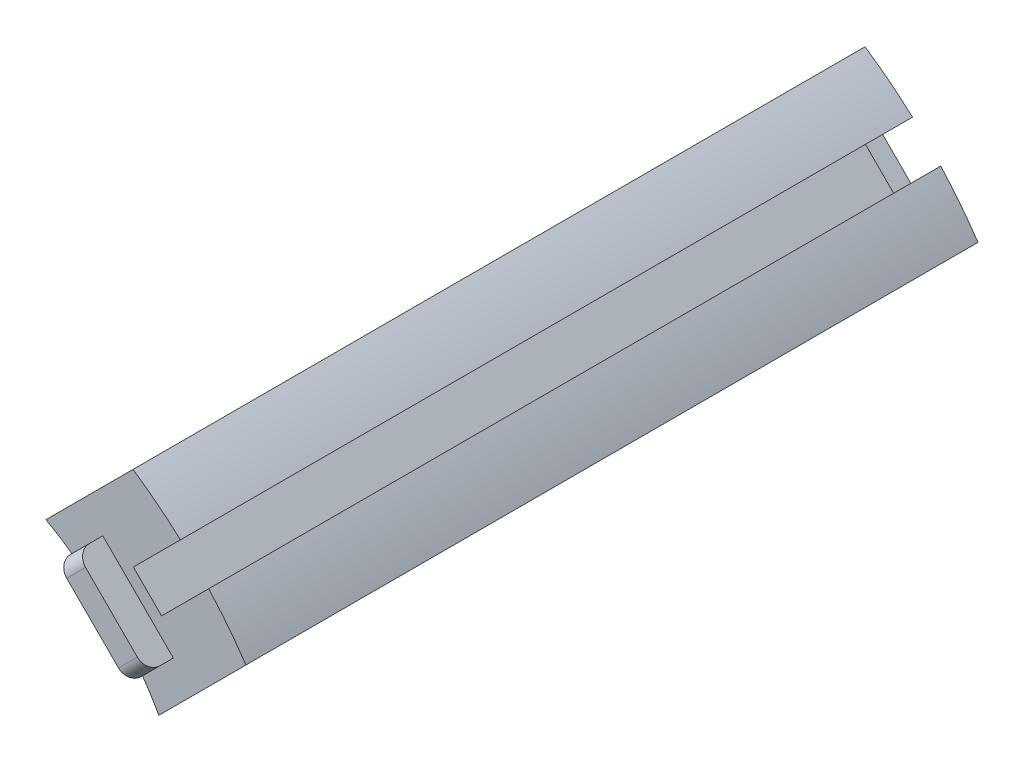
ISO-10303-21;
HEADER;
FILE_DESCRIPTION(('STEP AP214'),'2;1');
FILE_NAME('part.step','',(''),(''),'','','');
FILE_SCHEMA(('AUTOMOTIVE_DESIGN { 1 0 10303 214 1 1 1 1 }'));
ENDSEC;
DATA;
#1=APPLICATION_CONTEXT('core data for automotive mechanical design processes');
#2=APPLICATION_PROTOCOL_DEFINITION('international standard','automotive_design',2000,#1);
#3=PRODUCT_CONTEXT('',#1,'mechanical');
#4=PRODUCT('Part','Part','',(#3));
#5=PRODUCT_RELATED_PRODUCT_CATEGORY('part','',(#4));
#6=PRODUCT_DEFINITION_FORMATION('','',#4);
#7=PRODUCT_DEFINITION_CONTEXT('part definition',#1,'design');
#8=PRODUCT_DEFINITION('design','',#6,#7);
#9=PRODUCT_DEFINITION_SHAPE('','',#8);
#10=(LENGTH_UNIT() NAMED_UNIT(*) SI_UNIT(.MILLI.,.METRE.));
#11=(NAMED_UNIT(*) PLANE_ANGLE_UNIT() SI_UNIT($,.RADIAN.));
#12=(NAMED_UNIT(*) SI_UNIT($,.STERADIAN.) SOLID_ANGLE_UNIT());
#13=UNCERTAINTY_MEASURE_WITH_UNIT(LENGTH_MEASURE(1.E-05),#10,'distance_accuracy_value','');
#14=(GEOMETRIC_REPRESENTATION_CONTEXT(3) GLOBAL_UNCERTAINTY_ASSIGNED_CONTEXT((#13)) GLOBAL_UNIT_ASSIGNED_CONTEXT((#10,
#11,#12)) REPRESENTATION_CONTEXT('',''));
#15=CARTESIAN_POINT('',(0.,0.,0.));
#16=DIRECTION('',(0.,0.,1.));
#17=DIRECTION('',(1.,0.,0.));
#18=AXIS2_PLACEMENT_3D('',#15,#16,#17);
#19=CARTESIAN_POINT('',(-0.0846540823924782,-0.00642855221168886,110.));
#20=DIRECTION('',(0.,0.,-1.));
#21=DIRECTION('',(-1.,0.,0.));
#22=AXIS2_PLACEMENT_3D('',#19,#20,#21);
#23=CYLINDRICAL_SURFACE('',#22,44.5);
#24=CARTESIAN_POINT('',(-0.0846540823924782,-0.00642855221168886,0.));
#25=DIRECTION('',(0.,0.,1.));
#26=DIRECTION('',(1.,0.,0.));
#27=AXIS2_PLACEMENT_3D('',#24,#25,#26);
#28=CIRCLE('',#27,44.5);
#29=CARTESIAN_POINT('',(38.7012048440975,21.808867625801,0.));
#30=VERTEX_POINT('',#29);
#31=CARTESIAN_POINT('',(21.7306420956204,38.7794303742782,0.));
#32=VERTEX_POINT('',#31);
#33=EDGE_CURVE('E232',#30,#32,#28,.T.);
#34=ORIENTED_EDGE('',*,*,#33,.F.);
#35=DIRECTION('',(0.,0.,-1.));
#36=VECTOR('',#35,1.);
#37=CARTESIAN_POINT('',(38.7012048440975,21.808867625801,110.));
#38=LINE('',#37,#36);
#39=CARTESIAN_POINT('',(38.7012048440975,21.808867625801,110.));
#40=VERTEX_POINT('',#39);
#41=EDGE_CURVE('E289',#40,#30,#38,.T.);
#42=ORIENTED_EDGE('',*,*,#41,.F.);
#43=CARTESIAN_POINT('',(-0.0846540823924782,-0.00642855221168886,110.));
#44=DIRECTION('',(0.,0.,1.));
#45=DIRECTION('',(1.,0.,0.));
#46=AXIS2_PLACEMENT_3D('',#43,#44,#45);
#47=CIRCLE('',#46,44.5);
#48=CARTESIAN_POINT('',(21.7306420956204,38.7794303742782,110.));
#49=VERTEX_POINT('',#48);
#50=EDGE_CURVE('E233',#40,#49,#47,.T.);
#51=ORIENTED_EDGE('',*,*,#50,.T.);
#52=DIRECTION('',(0.,0.,-1.));
#53=VECTOR('',#52,1.);
#54=CARTESIAN_POINT('',(21.7306420956204,38.7794303742782,110.));
#55=LINE('',#54,#53);
#56=EDGE_CURVE('E254',#49,#32,#55,.T.);
#57=ORIENTED_EDGE('',*,*,#56,.T.);
#58=EDGE_LOOP('',(#34,#42,#51,#57));
#59=FACE_BOUND('',#58,.T.);
#60=ADVANCED_FACE('F35',(#59),#23,.F.);
#61=CARTESIAN_POINT('',(8.44616860914818,-8.4461686091482,110.));
#62=DIRECTION('',(0.707106781186547,-0.707106781186548,0.));
#63=DIRECTION('',(0.707106781186548,0.707106781186547,0.));
#64=AXIS2_PLACEMENT_3D('',#61,#62,#63);
#65=PLANE('',#64);
#66=CARTESIAN_POINT('',(49.0034673312299,32.1111301129334,85.));
#67=DIRECTION('',(0.707106781186547,-0.707106781186548,0.));
#68=DIRECTION('',(0.707106781186548,0.707106781186547,0.));
#69=AXIS2_PLACEMENT_3D('',#66,#67,#68);
#70=CIRCLE('',#69,3.00000000000001);
#71=CARTESIAN_POINT('',(51.1247876747896,34.2324504564931,85.));
#72=VERTEX_POINT('',#71);
#73=EDGE_CURVE('E229',#72,#72,#70,.T.);
#74=ORIENTED_EDGE('',*,*,#73,.F.);
#75=EDGE_LOOP('',(#74));
#76=FACE_BOUND('',#75,.T.);
#77=CARTESIAN_POINT('',(49.0034673312299,32.1111301129334,55.));
#78=DIRECTION('',(0.707106781186547,-0.707106781186548,0.));
#79=DIRECTION('',(0.707106781186548,0.707106781186547,0.));
#80=AXIS2_PLACEMENT_3D('',#77,#78,#79);
#81=CIRCLE('',#80,2.99999999999999);
#82=CARTESIAN_POINT('',(51.1247876747895,34.232450456493,55.));
#83=VERTEX_POINT('',#82);
#84=EDGE_CURVE('E219',#83,#83,#81,.T.);
#85=ORIENTED_EDGE('',*,*,#84,.F.);
#86=EDGE_LOOP('',(#85));
#87=FACE_BOUND('',#86,.T.);
#88=CARTESIAN_POINT('',(49.0034673312299,32.1111301129334,25.));
#89=DIRECTION('',(0.707106781186547,-0.707106781186548,0.));
#90=DIRECTION('',(0.707106781186548,0.707106781186547,0.));
#91=AXIS2_PLACEMENT_3D('',#88,#89,#90);
#92=CIRCLE('',#91,3.);
#93=CARTESIAN_POINT('',(51.1247876747895,34.232450456493,25.));
#94=VERTEX_POINT('',#93);
#95=EDGE_CURVE('E209',#94,#94,#92,.T.);
#96=ORIENTED_EDGE('',*,*,#95,.F.);
#97=EDGE_LOOP('',(#96));
#98=FACE_BOUND('',#97,.T.);
#99=DIRECTION('',(-0.707106781186548,-0.707106781186547,0.));
#100=VECTOR('',#99,1.);
#101=CARTESIAN_POINT('',(8.44616860914818,-8.4461686091482,0.));
#102=LINE('',#101,#100);
#103=CARTESIAN_POINT('',(51.7725652241083,34.8802280058118,0.));
#104=VERTEX_POINT('',#103);
#105=EDGE_CURVE('E257',#104,#30,#102,.T.);
#106=ORIENTED_EDGE('',*,*,#105,.F.);
#107=DIRECTION('',(0.,0.,-1.));
#108=VECTOR('',#107,1.);
#109=CARTESIAN_POINT('',(51.7725652241083,34.8802280058118,110.));
#110=LINE('',#109,#108);
#111=CARTESIAN_POINT('',(51.7725652241083,34.8802280058118,110.));
#112=VERTEX_POINT('',#111);
#113=EDGE_CURVE('E287',#112,#104,#110,.T.);
#114=ORIENTED_EDGE('',*,*,#113,.F.);
#115=DIRECTION('',(-0.707106781186548,-0.707106781186547,0.));
#116=VECTOR('',#115,1.);
#117=CARTESIAN_POINT('',(8.44616860914818,-8.4461686091482,110.));
#118=LINE('',#117,#116);
#119=EDGE_CURVE('E236',#112,#40,#118,.T.);
#120=ORIENTED_EDGE('',*,*,#119,.T.);
#121=ORIENTED_EDGE('',*,*,#41,.T.);
#122=EDGE_LOOP('',(#106,#114,#120,#121));
#123=FACE_BOUND('',#122,.T.);
#124=ADVANCED_FACE('F384',(#76,#87,#98,#123),#65,.T.);
#125=CARTESIAN_POINT('',(-0.0846540823924782,-0.00642855221168886,110.));
#126=DIRECTION('',(0.,0.,-1.));
#127=DIRECTION('',(-1.,0.,0.));
#128=AXIS2_PLACEMENT_3D('',#125,#126,#127);
#129=CYLINDRICAL_SURFACE('',#128,62.5);
#130=CARTESIAN_POINT('',(-0.0846540823924782,-0.00642855221168886,0.));
#131=DIRECTION('',(0.,0.,1.));
#132=DIRECTION('',(1.,0.,0.));
#133=AXIS2_PLACEMENT_3D('',#130,#131,#132);
#134=CIRCLE('',#133,62.5);
#135=CARTESIAN_POINT('',(46.1798990381173,42.0154838811786,0.));
#136=VERTEX_POINT('',#135);
#137=EDGE_CURVE('E260',#104,#136,#134,.T.);
#138=ORIENTED_EDGE('',*,*,#137,.T.);
#139=DIRECTION('',(0.,0.,-1.));
#140=VECTOR('',#139,1.);
#141=CARTESIAN_POINT('',(46.1798990381173,42.0154838811786,110.));
#142=LINE('',#141,#140);
#143=CARTESIAN_POINT('',(46.1798990381173,42.0154838811786,110.));
#144=VERTEX_POINT('',#143);
#145=EDGE_CURVE('E285',#144,#136,#142,.T.);
#146=ORIENTED_EDGE('',*,*,#145,.F.);
#147=CARTESIAN_POINT('',(-0.0846540823924782,-0.00642855221168886,110.));
#148=DIRECTION('',(0.,0.,1.));
#149=DIRECTION('',(1.,0.,0.));
#150=AXIS2_PLACEMENT_3D('',#147,#148,#149);
#151=CIRCLE('',#150,62.5);
#152=EDGE_CURVE('E240',#112,#144,#151,.T.);
#153=ORIENTED_EDGE('',*,*,#152,.F.);
#154=ORIENTED_EDGE('',*,*,#113,.T.);
#155=EDGE_LOOP('',(#138,#146,#153,#154));
#156=FACE_BOUND('',#155,.T.);
#157=ADVANCED_FACE('F390',(#156),#129,.T.);
#158=CARTESIAN_POINT('',(2.08220757846926,-2.08220757846926,110.));
#159=DIRECTION('',(-0.707106781186547,0.707106781186549,0.));
#160=DIRECTION('',(-0.707106781186549,-0.707106781186547,0.));
#161=AXIS2_PLACEMENT_3D('',#158,#159,#160);
#162=PLANE('',#161);
#163=CARTESIAN_POINT('',(42.639506300551,38.4750911436123,85.));
#164=DIRECTION('',(-0.707106781186547,0.707106781186549,0.));
#165=DIRECTION('',(-0.707106781186549,-0.707106781186547,0.));
#166=AXIS2_PLACEMENT_3D('',#163,#164,#165);
#167=CIRCLE('',#166,3.00000000000001);
#168=CARTESIAN_POINT('',(40.5181859569913,36.3537708000527,85.));
#169=VERTEX_POINT('',#168);
#170=EDGE_CURVE('E226',#169,#169,#167,.T.);
#171=ORIENTED_EDGE('',*,*,#170,.F.);
#172=EDGE_LOOP('',(#171));
#173=FACE_BOUND('',#172,.T.);
#174=CARTESIAN_POINT('',(42.639506300551,38.4750911436123,55.));
#175=DIRECTION('',(-0.707106781186547,0.707106781186549,0.));
#176=DIRECTION('',(-0.707106781186549,-0.707106781186547,0.));
#177=AXIS2_PLACEMENT_3D('',#174,#175,#176);
#178=CIRCLE('',#177,2.99999999999999);
#179=CARTESIAN_POINT('',(40.5181859569913,36.3537708000527,55.));
#180=VERTEX_POINT('',#179);
#181=EDGE_CURVE('E216',#180,#180,#178,.T.);
#182=ORIENTED_EDGE('',*,*,#181,.F.);
#183=EDGE_LOOP('',(#182));
#184=FACE_BOUND('',#183,.T.);
#185=CARTESIAN_POINT('',(42.639506300551,38.4750911436123,25.));
#186=DIRECTION('',(-0.707106781186547,0.707106781186549,0.));
#187=DIRECTION('',(-0.707106781186549,-0.707106781186547,0.));
#188=AXIS2_PLACEMENT_3D('',#185,#186,#187);
#189=CIRCLE('',#188,3.);
#190=CARTESIAN_POINT('',(40.5181859569913,36.3537708000527,25.));
#191=VERTEX_POINT('',#190);
#192=EDGE_CURVE('E206',#191,#191,#189,.T.);
#193=ORIENTED_EDGE('',*,*,#192,.F.);
#194=EDGE_LOOP('',(#193));
#195=FACE_BOUND('',#194,.T.);
#196=DIRECTION('',(0.707106781186549,0.707106781186547,0.));
#197=VECTOR('',#196,1.);
#198=CARTESIAN_POINT('',(2.08220757846926,-2.08220757846926,0.));
#199=LINE('',#198,#197);
#200=CARTESIAN_POINT('',(39.0991135629847,34.9346984060461,0.));
#201=VERTEX_POINT('',#200);
#202=EDGE_CURVE('E263',#201,#136,#199,.T.);
#203=ORIENTED_EDGE('',*,*,#202,.F.);
#204=DIRECTION('',(0.,0.,-1.));
#205=VECTOR('',#204,1.);
#206=CARTESIAN_POINT('',(39.0991135629847,34.9346984060461,110.));
#207=LINE('',#206,#205);
#208=CARTESIAN_POINT('',(39.0991135629847,34.9346984060461,110.));
#209=VERTEX_POINT('',#208);
#210=EDGE_CURVE('E283',#209,#201,#207,.T.);
#211=ORIENTED_EDGE('',*,*,#210,.F.);
#212=DIRECTION('',(0.707106781186549,0.707106781186547,0.));
#213=VECTOR('',#212,1.);
#214=CARTESIAN_POINT('',(2.08220757846926,-2.08220757846926,110.));
#215=LINE('',#214,#213);
#216=EDGE_CURVE('E242',#209,#144,#215,.T.);
#217=ORIENTED_EDGE('',*,*,#216,.T.);
#218=ORIENTED_EDGE('',*,*,#145,.T.);
#219=EDGE_LOOP('',(#203,#211,#217,#218));
#220=FACE_BOUND('',#219,.T.);
#221=ADVANCED_FACE('F604',(#173,#184,#195,#220),#162,.T.);
#222=CARTESIAN_POINT('',(37.0169059845155,37.0169059845153,110.));
#223=DIRECTION('',(0.707106781186549,0.707106781186546,0.));
#224=DIRECTION('',(-0.707106781186546,0.707106781186549,0.));
#225=AXIS2_PLACEMENT_3D('',#222,#223,#224);
#226=PLANE('',#225);
#227=DIRECTION('',(0.707106781186546,-0.707106781186549,0.));
#228=VECTOR('',#227,1.);
#229=CARTESIAN_POINT('',(37.0169059845155,37.0169059845153,0.));
#230=LINE('',#229,#228);
#231=CARTESIAN_POINT('',(34.8564728758654,39.1773390931654,0.));
#232=VERTEX_POINT('',#231);
#233=EDGE_CURVE('E267',#232,#201,#230,.T.);
#234=ORIENTED_EDGE('',*,*,#233,.F.);
#235=DIRECTION('',(0.,0.,-1.));
#236=VECTOR('',#235,1.);
#237=CARTESIAN_POINT('',(34.8564728758654,39.1773390931654,110.));
#238=LINE('',#237,#236);
#239=CARTESIAN_POINT('',(34.8564728758654,39.1773390931654,110.));
#240=VERTEX_POINT('',#239);
#241=EDGE_CURVE('E281',#240,#232,#238,.T.);
#242=ORIENTED_EDGE('',*,*,#241,.F.);
#243=DIRECTION('',(0.707106781186546,-0.707106781186549,0.));
#244=VECTOR('',#243,1.);
#245=CARTESIAN_POINT('',(37.0169059845155,37.0169059845153,110.));
#246=LINE('',#245,#244);
#247=EDGE_CURVE('E246',#240,#209,#246,.T.);
#248=ORIENTED_EDGE('',*,*,#247,.T.);
#249=ORIENTED_EDGE('',*,*,#210,.T.);
#250=EDGE_LOOP('',(#234,#242,#248,#249));
#251=FACE_BOUND('',#250,.T.);
#252=ADVANCED_FACE('F596',(#251),#226,.T.);
#253=CARTESIAN_POINT('',(-2.16043310865009,2.1604331086501,110.));
#254=DIRECTION('',(0.707106781186546,-0.70710678118655,0.));
#255=DIRECTION('',(0.70710678118655,0.707106781186546,0.));
#256=AXIS2_PLACEMENT_3D('',#253,#254,#255);
#257=PLANE('',#256);
#258=CARTESIAN_POINT('',(38.3968656134317,42.7177318307316,85.));
#259=DIRECTION('',(0.707106781186546,-0.70710678118655,0.));
#260=DIRECTION('',(0.70710678118655,0.707106781186546,0.));
#261=AXIS2_PLACEMENT_3D('',#258,#259,#260);
#262=CIRCLE('',#261,3.00000000000001);
#263=CARTESIAN_POINT('',(40.5181859569913,44.8390521742913,85.));
#264=VERTEX_POINT('',#263);
#265=EDGE_CURVE('E223',#264,#264,#262,.T.);
#266=ORIENTED_EDGE('',*,*,#265,.F.);
#267=EDGE_LOOP('',(#266));
#268=FACE_BOUND('',#267,.T.);
#269=CARTESIAN_POINT('',(38.3968656134317,42.7177318307316,55.));
#270=DIRECTION('',(0.707106781186546,-0.70710678118655,0.));
#271=DIRECTION('',(0.70710678118655,0.707106781186546,0.));
#272=AXIS2_PLACEMENT_3D('',#269,#270,#271);
#273=CIRCLE('',#272,2.99999999999999);
#274=CARTESIAN_POINT('',(40.5181859569913,44.8390521742913,55.));
#275=VERTEX_POINT('',#274);
#276=EDGE_CURVE('E213',#275,#275,#273,.T.);
#277=ORIENTED_EDGE('',*,*,#276,.F.);
#278=EDGE_LOOP('',(#277));
#279=FACE_BOUND('',#278,.T.);
#280=CARTESIAN_POINT('',(38.3968656134317,42.7177318307316,25.));
#281=DIRECTION('',(0.707106781186546,-0.70710678118655,0.));
#282=DIRECTION('',(0.70710678118655,0.707106781186546,0.));
#283=AXIS2_PLACEMENT_3D('',#280,#281,#282);
#284=CIRCLE('',#283,3.);
#285=CARTESIAN_POINT('',(40.5181859569913,44.8390521742913,25.));
#286=VERTEX_POINT('',#285);
#287=EDGE_CURVE('E203',#286,#286,#284,.T.);
#288=ORIENTED_EDGE('',*,*,#287,.F.);
#289=EDGE_LOOP('',(#288));
#290=FACE_BOUND('',#289,.T.);
#291=DIRECTION('',(-0.70710678118655,-0.707106781186546,0.));
#292=VECTOR('',#291,1.);
#293=CARTESIAN_POINT('',(-2.16043310865009,2.1604331086501,0.));
#294=LINE('',#293,#292);
#295=CARTESIAN_POINT('',(41.937258350998,46.258124568298,0.));
#296=VERTEX_POINT('',#295);
#297=EDGE_CURVE('E270',#296,#232,#294,.T.);
#298=ORIENTED_EDGE('',*,*,#297,.F.);
#299=DIRECTION('',(0.,0.,-1.));
#300=VECTOR('',#299,1.);
#301=CARTESIAN_POINT('',(41.937258350998,46.258124568298,110.));
#302=LINE('',#301,#300);
#303=CARTESIAN_POINT('',(41.937258350998,46.258124568298,110.));
#304=VERTEX_POINT('',#303);
#305=EDGE_CURVE('E279',#304,#296,#302,.T.);
#306=ORIENTED_EDGE('',*,*,#305,.F.);
#307=DIRECTION('',(-0.70710678118655,-0.707106781186546,0.));
#308=VECTOR('',#307,1.);
#309=CARTESIAN_POINT('',(-2.16043310865009,2.1604331086501,110.));
#310=LINE('',#309,#308);
#311=EDGE_CURVE('E249',#304,#240,#310,.T.);
#312=ORIENTED_EDGE('',*,*,#311,.T.);
#313=ORIENTED_EDGE('',*,*,#241,.T.);
#314=EDGE_LOOP('',(#298,#306,#312,#313));
#315=FACE_BOUND('',#314,.T.);
#316=ADVANCED_FACE('F591',(#268,#279,#290,#315),#257,.T.);
#317=CARTESIAN_POINT('',(34.8020024756312,51.850790754289,0.));
#318=VERTEX_POINT('',#317);
#319=EDGE_CURVE('E264',#296,#318,#134,.T.);
#320=ORIENTED_EDGE('',*,*,#319,.T.);
#321=DIRECTION('',(0.,0.,-1.));
#322=VECTOR('',#321,1.);
#323=CARTESIAN_POINT('',(34.8020024756312,51.850790754289,110.));
#324=LINE('',#323,#322);
#325=CARTESIAN_POINT('',(34.8020024756312,51.850790754289,110.));
#326=VERTEX_POINT('',#325);
#327=EDGE_CURVE('E276',#326,#318,#324,.T.);
#328=ORIENTED_EDGE('',*,*,#327,.F.);
#329=EDGE_CURVE('E243',#304,#326,#151,.T.);
#330=ORIENTED_EDGE('',*,*,#329,.F.);
#331=ORIENTED_EDGE('',*,*,#305,.T.);
#332=EDGE_LOOP('',(#320,#328,#330,#331));
#333=FACE_BOUND('',#332,.T.);
#334=ADVANCED_FACE('F583',(#333),#129,.T.);
#335=CARTESIAN_POINT('',(-8.52439413932895,8.52439413932899,110.));
#336=DIRECTION('',(0.707106781186546,-0.707106781186549,0.));
#337=DIRECTION('',(0.707106781186549,0.707106781186546,0.));
#338=AXIS2_PLACEMENT_3D('',#335,#336,#337);
#339=PLANE('',#338);
#340=CARTESIAN_POINT('',(32.0329045827528,49.0816928614106,85.));
#341=DIRECTION('',(0.707106781186546,-0.707106781186549,0.));
#342=DIRECTION('',(0.707106781186549,0.707106781186546,0.));
#343=AXIS2_PLACEMENT_3D('',#340,#341,#342);
#344=CIRCLE('',#343,3.00000000000001);
#345=CARTESIAN_POINT('',(34.1542249263124,51.2030132049702,85.));
#346=VERTEX_POINT('',#345);
#347=EDGE_CURVE('E222',#346,#346,#344,.T.);
#348=ORIENTED_EDGE('',*,*,#347,.T.);
#349=EDGE_LOOP('',(#348));
#350=FACE_BOUND('',#349,.T.);
#351=CARTESIAN_POINT('',(32.0329045827528,49.0816928614106,55.));
#352=DIRECTION('',(0.707106781186546,-0.707106781186549,0.));
#353=DIRECTION('',(0.707106781186549,0.707106781186546,0.));
#354=AXIS2_PLACEMENT_3D('',#351,#352,#353);
#355=CIRCLE('',#354,2.99999999999999);
#356=CARTESIAN_POINT('',(34.1542249263124,51.2030132049702,55.));
#357=VERTEX_POINT('',#356);
#358=EDGE_CURVE('E212',#357,#357,#355,.T.);
#359=ORIENTED_EDGE('',*,*,#358,.T.);
#360=EDGE_LOOP('',(#359));
#361=FACE_BOUND('',#360,.T.);
#362=CARTESIAN_POINT('',(32.0329045827528,49.0816928614106,25.));
#363=DIRECTION('',(0.707106781186546,-0.707106781186549,0.));
#364=DIRECTION('',(0.707106781186549,0.707106781186546,0.));
#365=AXIS2_PLACEMENT_3D('',#362,#363,#364);
#366=CIRCLE('',#365,3.);
#367=CARTESIAN_POINT('',(34.1542249263124,51.2030132049702,25.));
#368=VERTEX_POINT('',#367);
#369=EDGE_CURVE('E202',#368,#368,#366,.T.);
#370=ORIENTED_EDGE('',*,*,#369,.T.);
#371=EDGE_LOOP('',(#370));
#372=FACE_BOUND('',#371,.T.);
#373=DIRECTION('',(-0.707106781186549,-0.707106781186546,0.));
#374=VECTOR('',#373,1.);
#375=CARTESIAN_POINT('',(-8.52439413932895,8.52439413932899,0.));
#376=LINE('',#375,#374);
#377=EDGE_CURVE('E237',#318,#32,#376,.T.);
#378=ORIENTED_EDGE('',*,*,#377,.T.);
#379=ORIENTED_EDGE('',*,*,#56,.F.);
#380=DIRECTION('',(-0.707106781186549,-0.707106781186546,0.));
#381=VECTOR('',#380,1.);
#382=CARTESIAN_POINT('',(-8.52439413932895,8.52439413932899,110.));
#383=LINE('',#382,#381);
#384=EDGE_CURVE('E252',#326,#49,#383,.T.);
#385=ORIENTED_EDGE('',*,*,#384,.F.);
#386=ORIENTED_EDGE('',*,*,#327,.T.);
#387=EDGE_LOOP('',(#378,#379,#385,#386));
#388=FACE_BOUND('',#387,.T.);
#389=ADVANCED_FACE('F524',(#350,#361,#372,#388),#339,.F.);
#390=CARTESIAN_POINT('',(0.,0.,110.));
#391=DIRECTION('',(0.,0.,1.));
#392=DIRECTION('',(1.,0.,0.));
#393=AXIS2_PLACEMENT_3D('',#390,#391,#392);
#394=PLANE('',#393);
#395=DIRECTION('',(0.70710678118655,0.707106781186545,0.));
#396=VECTOR('',#395,1.);
#397=CARTESIAN_POINT('',(5.26418809380865,-5.26418809380868,110.));
#398=LINE('',#397,#396);
#399=CARTESIAN_POINT('',(38.0384533912049,27.5100772035874,110.));
#400=VERTEX_POINT('',#399);
#401=CARTESIAN_POINT('',(40.8668805159511,30.3385043283335,110.));
#402=VERTEX_POINT('',#401);
#403=EDGE_CURVE('E200',#400,#402,#398,.T.);
#404=ORIENTED_EDGE('',*,*,#403,.F.);
#405=DIRECTION('',(0.707106781186546,-0.707106781186549,0.));
#406=VECTOR('',#405,1.);
#407=CARTESIAN_POINT('',(32.7742652973962,32.7742652973961,110.));
#408=LINE('',#407,#406);
#409=CARTESIAN_POINT('',(27.4318516734067,38.1166789213856,110.));
#410=VERTEX_POINT('',#409);
#411=EDGE_CURVE('E180',#410,#400,#408,.T.);
#412=ORIENTED_EDGE('',*,*,#411,.F.);
#413=DIRECTION('',(-0.707106781186547,-0.707106781186548,0.));
#414=VECTOR('',#413,1.);
#415=CARTESIAN_POINT('',(-5.34241362398942,5.34241362398942,110.));
#416=LINE('',#415,#414);
#417=CARTESIAN_POINT('',(30.2602787981529,40.9451060461318,110.));
#418=VERTEX_POINT('',#417);
#419=EDGE_CURVE('E173',#418,#410,#416,.T.);
#420=ORIENTED_EDGE('',*,*,#419,.F.);
#421=DIRECTION('',(-0.707106781186546,0.707106781186549,0.));
#422=VECTOR('',#421,1.);
#423=CARTESIAN_POINT('',(35.6026924221424,35.6026924221422,110.));
#424=LINE('',#423,#422);
#425=EDGE_CURVE('E177',#402,#418,#424,.T.);
#426=ORIENTED_EDGE('',*,*,#425,.F.);
#427=EDGE_LOOP('',(#404,#412,#420,#426));
#428=FACE_BOUND('',#427,.T.);
#429=ORIENTED_EDGE('',*,*,#50,.F.);
#430=ORIENTED_EDGE('',*,*,#119,.F.);
#431=ORIENTED_EDGE('',*,*,#152,.T.);
#432=ORIENTED_EDGE('',*,*,#216,.F.);
#433=ORIENTED_EDGE('',*,*,#247,.F.);
#434=ORIENTED_EDGE('',*,*,#311,.F.);
#435=ORIENTED_EDGE('',*,*,#329,.T.);
#436=ORIENTED_EDGE('',*,*,#384,.T.);
#437=EDGE_LOOP('',(#429,#430,#431,#432,#433,#434,#435,#436));
#438=FACE_BOUND('',#437,.T.);
#439=ADVANCED_FACE('F175',(#428,#438),#394,.T.);
#440=CARTESIAN_POINT('',(0.,0.,0.));
#441=DIRECTION('',(0.,0.,1.));
#442=DIRECTION('',(1.,0.,0.));
#443=AXIS2_PLACEMENT_3D('',#440,#441,#442);
#444=PLANE('',#443);
#445=DIRECTION('',(0.707106781186546,-0.707106781186549,0.));
#446=VECTOR('',#445,1.);
#447=CARTESIAN_POINT('',(32.7742652973962,32.7742652973961,0.));
#448=LINE('',#447,#446);
#449=CARTESIAN_POINT('',(27.4318516734067,38.1166789213856,0.));
#450=VERTEX_POINT('',#449);
#451=CARTESIAN_POINT('',(38.0384533912049,27.5100772035874,0.));
#452=VERTEX_POINT('',#451);
#453=EDGE_CURVE('E303',#450,#452,#448,.T.);
#454=ORIENTED_EDGE('',*,*,#453,.T.);
#455=DIRECTION('',(0.70710678118655,0.707106781186545,0.));
#456=VECTOR('',#455,1.);
#457=CARTESIAN_POINT('',(5.26418809380865,-5.26418809380868,0.));
#458=LINE('',#457,#456);
#459=CARTESIAN_POINT('',(40.8668805159511,30.3385043283335,0.));
#460=VERTEX_POINT('',#459);
#461=EDGE_CURVE('E306',#452,#460,#458,.T.);
#462=ORIENTED_EDGE('',*,*,#461,.T.);
#463=DIRECTION('',(-0.707106781186546,0.707106781186549,0.));
#464=VECTOR('',#463,1.);
#465=CARTESIAN_POINT('',(35.6026924221424,35.6026924221422,0.));
#466=LINE('',#465,#464);
#467=CARTESIAN_POINT('',(30.2602787981529,40.9451060461317,0.));
#468=VERTEX_POINT('',#467);
#469=EDGE_CURVE('E291',#460,#468,#466,.T.);
#470=ORIENTED_EDGE('',*,*,#469,.T.);
#471=DIRECTION('',(-0.707106781186547,-0.707106781186548,0.));
#472=VECTOR('',#471,1.);
#473=CARTESIAN_POINT('',(-5.34241362398942,5.34241362398942,0.));
#474=LINE('',#473,#472);
#475=EDGE_CURVE('E300',#468,#450,#474,.T.);
#476=ORIENTED_EDGE('',*,*,#475,.T.);
#477=EDGE_LOOP('',(#454,#462,#470,#476));
#478=FACE_BOUND('',#477,.T.);
#479=ORIENTED_EDGE('',*,*,#33,.T.);
#480=ORIENTED_EDGE('',*,*,#377,.F.);
#481=ORIENTED_EDGE('',*,*,#319,.F.);
#482=ORIENTED_EDGE('',*,*,#297,.T.);
#483=ORIENTED_EDGE('',*,*,#233,.T.);
#484=ORIENTED_EDGE('',*,*,#202,.T.);
#485=ORIENTED_EDGE('',*,*,#137,.F.);
#486=ORIENTED_EDGE('',*,*,#105,.T.);
#487=EDGE_LOOP('',(#479,#480,#481,#482,#483,#484,#485,#486));
#488=FACE_BOUND('',#487,.T.);
#489=ADVANCED_FACE('F507',(#478,#488),#444,.F.);
#490=CARTESIAN_POINT('',(81.530379265811,-0.415781821647823,25.));
#491=DIRECTION('',(-0.707106781186547,0.707106781186548,0.));
#492=DIRECTION('',(-0.707106781186548,-0.707106781186547,0.));
#493=AXIS2_PLACEMENT_3D('',#490,#491,#492);
#494=CYLINDRICAL_SURFACE('',#493,3.);
#495=ORIENTED_EDGE('',*,*,#287,.T.);
#496=EDGE_LOOP('',(#495));
#497=FACE_BOUND('',#496,.T.);
#498=ORIENTED_EDGE('',*,*,#369,.F.);
#499=EDGE_LOOP('',(#498));
#500=FACE_BOUND('',#499,.T.);
#501=ADVANCED_FACE('F512',(#497,#500),#494,.F.);
#502=CARTESIAN_POINT('',(81.530379265811,-0.415781821647823,55.));
#503=DIRECTION('',(-0.707106781186547,0.707106781186548,0.));
#504=DIRECTION('',(-0.707106781186548,-0.707106781186547,0.));
#505=AXIS2_PLACEMENT_3D('',#502,#503,#504);
#506=CYLINDRICAL_SURFACE('',#505,2.99999999999999);
#507=ORIENTED_EDGE('',*,*,#276,.T.);
#508=EDGE_LOOP('',(#507));
#509=FACE_BOUND('',#508,.T.);
#510=ORIENTED_EDGE('',*,*,#358,.F.);
#511=EDGE_LOOP('',(#510));
#512=FACE_BOUND('',#511,.T.);
#513=ADVANCED_FACE('F546',(#509,#512),#506,.F.);
#514=CARTESIAN_POINT('',(81.530379265811,-0.415781821647823,85.));
#515=DIRECTION('',(-0.707106781186547,0.707106781186548,0.));
#516=DIRECTION('',(-0.707106781186548,-0.707106781186547,0.));
#517=AXIS2_PLACEMENT_3D('',#514,#515,#516);
#518=CYLINDRICAL_SURFACE('',#517,3.00000000000001);
#519=ORIENTED_EDGE('',*,*,#265,.T.);
#520=EDGE_LOOP('',(#519));
#521=FACE_BOUND('',#520,.T.);
#522=ORIENTED_EDGE('',*,*,#347,.F.);
#523=EDGE_LOOP('',(#522));
#524=FACE_BOUND('',#523,.T.);
#525=ADVANCED_FACE('F535',(#521,#524),#518,.F.);
#526=ORIENTED_EDGE('',*,*,#95,.T.);
#527=EDGE_LOOP('',(#526));
#528=FACE_BOUND('',#527,.T.);
#529=ORIENTED_EDGE('',*,*,#192,.T.);
#530=EDGE_LOOP('',(#529));
#531=FACE_BOUND('',#530,.T.);
#532=ADVANCED_FACE('F543',(#528,#531),#494,.F.);
#533=ORIENTED_EDGE('',*,*,#84,.T.);
#534=EDGE_LOOP('',(#533));
#535=FACE_BOUND('',#534,.T.);
#536=ORIENTED_EDGE('',*,*,#181,.T.);
#537=EDGE_LOOP('',(#536));
#538=FACE_BOUND('',#537,.T.);
#539=ADVANCED_FACE('F533',(#535,#538),#506,.F.);
#540=ORIENTED_EDGE('',*,*,#73,.T.);
#541=EDGE_LOOP('',(#540));
#542=FACE_BOUND('',#541,.T.);
#543=ORIENTED_EDGE('',*,*,#170,.T.);
#544=EDGE_LOOP('',(#543));
#545=FACE_BOUND('',#544,.T.);
#546=ADVANCED_FACE('F499',(#542,#545),#518,.F.);
#547=CARTESIAN_POINT('',(0.,0.,-4.));
#548=DIRECTION('',(0.,0.,1.));
#549=DIRECTION('',(1.,0.,0.));
#550=AXIS2_PLACEMENT_3D('',#547,#548,#549);
#551=PLANE('',#550);
#552=DIRECTION('',(0.707106781186546,-0.707106781186549,0.));
#553=VECTOR('',#552,1.);
#554=CARTESIAN_POINT('',(32.7742652973962,32.7742652973961,-4.));
#555=LINE('',#554,#553);
#556=CARTESIAN_POINT('',(28.8460652357798,36.7024653590125,-4.));
#557=VERTEX_POINT('',#556);
#558=CARTESIAN_POINT('',(36.6242398288318,28.9242907659604,-4.));
#559=VERTEX_POINT('',#558);
#560=EDGE_CURVE('E361',#557,#559,#555,.T.);
#561=ORIENTED_EDGE('',*,*,#560,.F.);
#562=DIRECTION('',(-0.707106781186547,-0.707106781186548,0.));
#563=VECTOR('',#562,1.);
#564=CARTESIAN_POINT('',(31.674492360526,39.5308924837587,-4.));
#565=LINE('',#564,#563);
#566=CARTESIAN_POINT('',(31.674492360526,39.5308924837586,-4.));
#567=VERTEX_POINT('',#566);
#568=EDGE_CURVE('E318',#557,#567,#565,.F.);
#569=ORIENTED_EDGE('',*,*,#568,.T.);
#570=DIRECTION('',(-0.707106781186546,0.707106781186549,0.));
#571=VECTOR('',#570,1.);
#572=CARTESIAN_POINT('',(35.6026924221424,35.6026924221422,-4.));
#573=LINE('',#572,#571);
#574=CARTESIAN_POINT('',(39.452666953578,31.7527178907066,-4.));
#575=VERTEX_POINT('',#574);
#576=EDGE_CURVE('E364',#575,#567,#573,.T.);
#577=ORIENTED_EDGE('',*,*,#576,.F.);
#578=DIRECTION('',(0.70710678118655,0.707106781186545,0.));
#579=VECTOR('',#578,1.);
#580=CARTESIAN_POINT('',(36.6242398288318,28.9242907659604,-4.));
#581=LINE('',#580,#579);
#582=EDGE_CURVE('E316',#575,#559,#581,.F.);
#583=ORIENTED_EDGE('',*,*,#582,.T.);
#584=EDGE_LOOP('',(#561,#569,#577,#583));
#585=FACE_BOUND('',#584,.T.);
#586=ADVANCED_FACE('F490',(#585),#551,.F.);
#587=CARTESIAN_POINT('',(35.6026924221424,35.6026924221422,-4.));
#588=DIRECTION('',(0.707106781186549,0.707106781186546,0.));
#589=DIRECTION('',(-0.707106781186546,0.707106781186549,0.));
#590=AXIS2_PLACEMENT_3D('',#587,#588,#589);
#591=PLANE('',#590);
#592=ORIENTED_EDGE('',*,*,#576,.T.);
#593=CARTESIAN_POINT('',(31.674492360526,39.5308924837586,-2.));
#594=DIRECTION('',(0.707106781186549,0.707106781186546,0.));
#595=DIRECTION('',(-0.707106781186546,0.707106781186549,0.));
#596=AXIS2_PLACEMENT_3D('',#593,#594,#595);
#597=CIRCLE('',#596,2.);
#598=CARTESIAN_POINT('',(30.2602787981529,40.9451060461318,-2.));
#599=VERTEX_POINT('',#598);
#600=EDGE_CURVE('E322',#567,#599,#597,.T.);
#601=ORIENTED_EDGE('',*,*,#600,.T.);
#602=DIRECTION('',(0.,0.,1.));
#603=VECTOR('',#602,1.);
#604=CARTESIAN_POINT('',(30.2602787981529,40.9451060461318,-4.));
#605=LINE('',#604,#603);
#606=EDGE_CURVE('E190',#599,#468,#605,.T.);
#607=ORIENTED_EDGE('',*,*,#606,.T.);
#608=ORIENTED_EDGE('',*,*,#469,.F.);
#609=DIRECTION('',(0.,0.,1.));
#610=VECTOR('',#609,1.);
#611=CARTESIAN_POINT('',(40.8668805159511,30.3385043283335,-4.));
#612=LINE('',#611,#610);
#613=CARTESIAN_POINT('',(40.8668805159511,30.3385043283335,-2.));
#614=VERTEX_POINT('',#613);
#615=EDGE_CURVE('E191',#614,#460,#612,.T.);
#616=ORIENTED_EDGE('',*,*,#615,.F.);
#617=CARTESIAN_POINT('',(39.452666953578,31.7527178907066,-2.));
#618=DIRECTION('',(0.707106781186549,0.707106781186546,0.));
#619=DIRECTION('',(-0.707106781186546,0.707106781186549,0.));
#620=AXIS2_PLACEMENT_3D('',#617,#618,#619);
#621=CIRCLE('',#620,2.);
#622=EDGE_CURVE('E320',#614,#575,#621,.T.);
#623=ORIENTED_EDGE('',*,*,#622,.T.);
#624=EDGE_LOOP('',(#592,#601,#607,#608,#616,#623));
#625=FACE_BOUND('',#624,.T.);
#626=ADVANCED_FACE('F442',(#625),#591,.T.);
#627=CARTESIAN_POINT('',(-5.34241362398942,5.34241362398941,-4.));
#628=DIRECTION('',(-0.707106781186548,0.707106781186547,0.));
#629=DIRECTION('',(-0.707106781186547,-0.707106781186548,0.));
#630=AXIS2_PLACEMENT_3D('',#627,#628,#629);
#631=PLANE('',#630);
#632=ORIENTED_EDGE('',*,*,#606,.F.);
#633=DIRECTION('',(-0.707106781186547,-0.707106781186548,0.));
#634=VECTOR('',#633,1.);
#635=CARTESIAN_POINT('',(27.4318516734067,38.1166789213856,-2.));
#636=LINE('',#635,#634);
#637=CARTESIAN_POINT('',(27.4318516734067,38.1166789213856,-2.));
#638=VERTEX_POINT('',#637);
#639=EDGE_CURVE('E309',#599,#638,#636,.T.);
#640=ORIENTED_EDGE('',*,*,#639,.T.);
#641=DIRECTION('',(0.,0.,1.));
#642=VECTOR('',#641,1.);
#643=CARTESIAN_POINT('',(27.4318516734067,38.1166789213856,-4.));
#644=LINE('',#643,#642);
#645=EDGE_CURVE('E196',#638,#450,#644,.T.);
#646=ORIENTED_EDGE('',*,*,#645,.T.);
#647=ORIENTED_EDGE('',*,*,#475,.F.);
#648=EDGE_LOOP('',(#632,#640,#646,#647));
#649=FACE_BOUND('',#648,.T.);
#650=ADVANCED_FACE('F451',(#649),#631,.T.);
#651=CARTESIAN_POINT('',(32.7742652973962,32.7742652973961,-4.));
#652=DIRECTION('',(-0.707106781186549,-0.707106781186546,0.));
#653=DIRECTION('',(0.707106781186546,-0.707106781186549,0.));
#654=AXIS2_PLACEMENT_3D('',#651,#652,#653);
#655=PLANE('',#654);
#656=ORIENTED_EDGE('',*,*,#645,.F.);
#657=CARTESIAN_POINT('',(28.8460652357798,36.7024653590125,-2.));
#658=DIRECTION('',(-0.707106781186549,-0.707106781186546,0.));
#659=DIRECTION('',(0.707106781186546,-0.707106781186549,0.));
#660=AXIS2_PLACEMENT_3D('',#657,#658,#659);
#661=CIRCLE('',#660,2.);
#662=EDGE_CURVE('E314',#638,#557,#661,.T.);
#663=ORIENTED_EDGE('',*,*,#662,.T.);
#664=ORIENTED_EDGE('',*,*,#560,.T.);
#665=CARTESIAN_POINT('',(36.6242398288318,28.9242907659604,-2.));
#666=DIRECTION('',(-0.707106781186549,-0.707106781186546,0.));
#667=DIRECTION('',(0.707106781186546,-0.707106781186549,0.));
#668=AXIS2_PLACEMENT_3D('',#665,#666,#667);
#669=CIRCLE('',#668,2.);
#670=CARTESIAN_POINT('',(38.0384533912049,27.5100772035874,-2.));
#671=VERTEX_POINT('',#670);
#672=EDGE_CURVE('E312',#559,#671,#669,.T.);
#673=ORIENTED_EDGE('',*,*,#672,.T.);
#674=DIRECTION('',(0.,0.,1.));
#675=VECTOR('',#674,1.);
#676=CARTESIAN_POINT('',(38.0384533912049,27.5100772035874,-4.));
#677=LINE('',#676,#675);
#678=EDGE_CURVE('E187',#671,#452,#677,.T.);
#679=ORIENTED_EDGE('',*,*,#678,.T.);
#680=ORIENTED_EDGE('',*,*,#453,.F.);
#681=EDGE_LOOP('',(#656,#663,#664,#673,#679,#680));
#682=FACE_BOUND('',#681,.T.);
#683=ADVANCED_FACE('F379',(#682),#655,.T.);
#684=CARTESIAN_POINT('',(5.26418809380865,-5.26418809380868,-4.));
#685=DIRECTION('',(0.707106781186545,-0.70710678118655,0.));
#686=DIRECTION('',(0.70710678118655,0.707106781186545,0.));
#687=AXIS2_PLACEMENT_3D('',#684,#685,#686);
#688=PLANE('',#687);
#689=ORIENTED_EDGE('',*,*,#678,.F.);
#690=DIRECTION('',(0.70710678118655,0.707106781186545,0.));
#691=VECTOR('',#690,1.);
#692=CARTESIAN_POINT('',(40.8668805159511,30.3385043283335,-2.));
#693=LINE('',#692,#691);
#694=EDGE_CURVE('E324',#671,#614,#693,.T.);
#695=ORIENTED_EDGE('',*,*,#694,.T.);
#696=ORIENTED_EDGE('',*,*,#615,.T.);
#697=ORIENTED_EDGE('',*,*,#461,.F.);
#698=EDGE_LOOP('',(#689,#695,#696,#697));
#699=FACE_BOUND('',#698,.T.);
#700=ADVANCED_FACE('F372',(#699),#688,.T.);
#701=CARTESIAN_POINT('',(40.8668805159511,30.3385043283335,112.));
#702=VERTEX_POINT('',#701);
#703=EDGE_CURVE('E186',#402,#702,#612,.T.);
#704=ORIENTED_EDGE('',*,*,#703,.T.);
#705=DIRECTION('',(0.70710678118655,0.707106781186545,0.));
#706=VECTOR('',#705,1.);
#707=CARTESIAN_POINT('',(5.26418809380865,-5.26418809380868,112.));
#708=LINE('',#707,#706);
#709=CARTESIAN_POINT('',(38.0384533912049,27.5100772035874,112.));
#710=VERTEX_POINT('',#709);
#711=EDGE_CURVE('E11',#702,#710,#708,.F.);
#712=ORIENTED_EDGE('',*,*,#711,.T.);
#713=EDGE_CURVE('E352',#400,#710,#677,.T.);
#714=ORIENTED_EDGE('',*,*,#713,.F.);
#715=ORIENTED_EDGE('',*,*,#403,.T.);
#716=EDGE_LOOP('',(#704,#712,#714,#715));
#717=FACE_BOUND('',#716,.T.);
#718=ADVANCED_FACE('F370',(#717),#688,.T.);
#719=DIRECTION('',(0.707106781186546,-0.707106781186549,0.));
#720=VECTOR('',#719,1.);
#721=CARTESIAN_POINT('',(32.7742652973962,32.7742652973961,114.));
#722=LINE('',#721,#720);
#723=CARTESIAN_POINT('',(28.8460652357798,36.7024653590125,114.));
#724=VERTEX_POINT('',#723);
#725=CARTESIAN_POINT('',(36.6242398288318,28.9242907659604,114.));
#726=VERTEX_POINT('',#725);
#727=EDGE_CURVE('E347',#724,#726,#722,.T.);
#728=ORIENTED_EDGE('',*,*,#727,.F.);
#729=CARTESIAN_POINT('',(28.8460652357798,36.7024653590125,112.));
#730=DIRECTION('',(-0.707106781186549,-0.707106781186546,0.));
#731=DIRECTION('',(0.707106781186546,-0.707106781186549,0.));
#732=AXIS2_PLACEMENT_3D('',#729,#730,#731);
#733=CIRCLE('',#732,2.);
#734=CARTESIAN_POINT('',(27.4318516734067,38.1166789213856,112.));
#735=VERTEX_POINT('',#734);
#736=EDGE_CURVE('E335',#724,#735,#733,.T.);
#737=ORIENTED_EDGE('',*,*,#736,.T.);
#738=EDGE_CURVE('E193',#410,#735,#644,.T.);
#739=ORIENTED_EDGE('',*,*,#738,.F.);
#740=ORIENTED_EDGE('',*,*,#411,.T.);
#741=ORIENTED_EDGE('',*,*,#713,.T.);
#742=CARTESIAN_POINT('',(36.6242398288318,28.9242907659604,112.));
#743=DIRECTION('',(-0.707106781186549,-0.707106781186546,0.));
#744=DIRECTION('',(0.707106781186546,-0.707106781186549,0.));
#745=AXIS2_PLACEMENT_3D('',#742,#743,#744);
#746=CIRCLE('',#745,2.);
#747=EDGE_CURVE('E333',#710,#726,#746,.T.);
#748=ORIENTED_EDGE('',*,*,#747,.T.);
#749=EDGE_LOOP('',(#728,#737,#739,#740,#741,#748));
#750=FACE_BOUND('',#749,.T.);
#751=ADVANCED_FACE('F351',(#750),#655,.T.);
#752=ORIENTED_EDGE('',*,*,#738,.T.);
#753=DIRECTION('',(-0.707106781186547,-0.707106781186548,0.));
#754=VECTOR('',#753,1.);
#755=CARTESIAN_POINT('',(-5.34241362398942,5.34241362398941,112.));
#756=LINE('',#755,#754);
#757=CARTESIAN_POINT('',(30.2602787981529,40.9451060461318,112.));
#758=VERTEX_POINT('',#757);
#759=EDGE_CURVE('E58',#735,#758,#756,.F.);
#760=ORIENTED_EDGE('',*,*,#759,.T.);
#761=EDGE_CURVE('E184',#418,#758,#605,.T.);
#762=ORIENTED_EDGE('',*,*,#761,.F.);
#763=ORIENTED_EDGE('',*,*,#419,.T.);
#764=EDGE_LOOP('',(#752,#760,#762,#763));
#765=FACE_BOUND('',#764,.T.);
#766=ADVANCED_FACE('F189',(#765),#631,.T.);
#767=ORIENTED_EDGE('',*,*,#761,.T.);
#768=CARTESIAN_POINT('',(31.674492360526,39.5308924837586,112.));
#769=DIRECTION('',(0.707106781186549,0.707106781186546,0.));
#770=DIRECTION('',(-0.707106781186546,0.707106781186549,0.));
#771=AXIS2_PLACEMENT_3D('',#768,#769,#770);
#772=CIRCLE('',#771,2.);
#773=CARTESIAN_POINT('',(31.674492360526,39.5308924837587,114.));
#774=VERTEX_POINT('',#773);
#775=EDGE_CURVE('E43',#758,#774,#772,.T.);
#776=ORIENTED_EDGE('',*,*,#775,.T.);
#777=DIRECTION('',(-0.707106781186546,0.707106781186549,0.));
#778=VECTOR('',#777,1.);
#779=CARTESIAN_POINT('',(35.6026924221424,35.6026924221422,114.));
#780=LINE('',#779,#778);
#781=CARTESIAN_POINT('',(39.452666953578,31.7527178907066,114.));
#782=VERTEX_POINT('',#781);
#783=EDGE_CURVE('E339',#782,#774,#780,.T.);
#784=ORIENTED_EDGE('',*,*,#783,.F.);
#785=CARTESIAN_POINT('',(39.452666953578,31.7527178907066,112.));
#786=DIRECTION('',(0.707106781186549,0.707106781186546,0.));
#787=DIRECTION('',(-0.707106781186546,0.707106781186549,0.));
#788=AXIS2_PLACEMENT_3D('',#785,#786,#787);
#789=CIRCLE('',#788,2.);
#790=EDGE_CURVE('E50',#782,#702,#789,.T.);
#791=ORIENTED_EDGE('',*,*,#790,.T.);
#792=ORIENTED_EDGE('',*,*,#703,.F.);
#793=ORIENTED_EDGE('',*,*,#425,.T.);
#794=EDGE_LOOP('',(#767,#776,#784,#791,#792,#793));
#795=FACE_BOUND('',#794,.T.);
#796=ADVANCED_FACE('F183',(#795),#591,.T.);
#797=CARTESIAN_POINT('',(0.,0.,114.));
#798=DIRECTION('',(0.,0.,1.));
#799=DIRECTION('',(1.,0.,0.));
#800=AXIS2_PLACEMENT_3D('',#797,#798,#799);
#801=PLANE('',#800);
#802=ORIENTED_EDGE('',*,*,#783,.T.);
#803=DIRECTION('',(-0.707106781186547,-0.707106781186548,0.));
#804=VECTOR('',#803,1.);
#805=CARTESIAN_POINT('',(-3.92820006161633,3.92820006161632,114.));
#806=LINE('',#805,#804);
#807=EDGE_CURVE('E330',#774,#724,#806,.T.);
#808=ORIENTED_EDGE('',*,*,#807,.T.);
#809=ORIENTED_EDGE('',*,*,#727,.T.);
#810=DIRECTION('',(0.70710678118655,0.707106781186545,0.));
#811=VECTOR('',#810,1.);
#812=CARTESIAN_POINT('',(3.84997453143555,-3.84997453143558,114.));
#813=LINE('',#812,#811);
#814=EDGE_CURVE('E327',#726,#782,#813,.T.);
#815=ORIENTED_EDGE('',*,*,#814,.T.);
#816=EDGE_LOOP('',(#802,#808,#809,#815));
#817=FACE_BOUND('',#816,.T.);
#818=ADVANCED_FACE('F343',(#817),#801,.T.);
#819=CARTESIAN_POINT('',(-3.92820006161633,3.92820006161632,-2.));
#820=DIRECTION('',(0.707106781186547,0.707106781186548,0.));
#821=DIRECTION('',(-0.707106781186548,0.707106781186547,0.));
#822=AXIS2_PLACEMENT_3D('',#819,#820,#821);
#823=CYLINDRICAL_SURFACE('',#822,2.);
#824=ORIENTED_EDGE('',*,*,#600,.F.);
#825=ORIENTED_EDGE('',*,*,#568,.F.);
#826=ORIENTED_EDGE('',*,*,#662,.F.);
#827=ORIENTED_EDGE('',*,*,#639,.F.);
#828=EDGE_LOOP('',(#824,#825,#826,#827));
#829=FACE_BOUND('',#828,.T.);
#830=ADVANCED_FACE('F396',(#829),#823,.T.);
#831=CARTESIAN_POINT('',(3.84997453143556,-3.84997453143558,-2.));
#832=DIRECTION('',(-0.70710678118655,-0.707106781186545,0.));
#833=DIRECTION('',(0.707106781186545,-0.70710678118655,0.));
#834=AXIS2_PLACEMENT_3D('',#831,#832,#833);
#835=CYLINDRICAL_SURFACE('',#834,2.);
#836=ORIENTED_EDGE('',*,*,#672,.F.);
#837=ORIENTED_EDGE('',*,*,#582,.F.);
#838=ORIENTED_EDGE('',*,*,#622,.F.);
#839=ORIENTED_EDGE('',*,*,#694,.F.);
#840=EDGE_LOOP('',(#836,#837,#838,#839));
#841=FACE_BOUND('',#840,.T.);
#842=ADVANCED_FACE('F399',(#841),#835,.T.);
#843=CARTESIAN_POINT('',(-3.92820006161633,3.92820006161632,112.));
#844=DIRECTION('',(-0.707106781186547,-0.707106781186548,0.));
#845=DIRECTION('',(0.707106781186548,-0.707106781186547,0.));
#846=AXIS2_PLACEMENT_3D('',#843,#844,#845);
#847=CYLINDRICAL_SURFACE('',#846,2.);
#848=ORIENTED_EDGE('',*,*,#775,.F.);
#849=ORIENTED_EDGE('',*,*,#759,.F.);
#850=ORIENTED_EDGE('',*,*,#736,.F.);
#851=ORIENTED_EDGE('',*,*,#807,.F.);
#852=EDGE_LOOP('',(#848,#849,#850,#851));
#853=FACE_BOUND('',#852,.T.);
#854=ADVANCED_FACE('F349',(#853),#847,.T.);
#855=CARTESIAN_POINT('',(3.84997453143555,-3.84997453143558,112.));
#856=DIRECTION('',(0.70710678118655,0.707106781186545,0.));
#857=DIRECTION('',(-0.707106781186545,0.70710678118655,0.));
#858=AXIS2_PLACEMENT_3D('',#855,#856,#857);
#859=CYLINDRICAL_SURFACE('',#858,2.);
#860=ORIENTED_EDGE('',*,*,#747,.F.);
#861=ORIENTED_EDGE('',*,*,#711,.F.);
#862=ORIENTED_EDGE('',*,*,#790,.F.);
#863=ORIENTED_EDGE('',*,*,#814,.F.);
#864=EDGE_LOOP('',(#860,#861,#862,#863));
#865=FACE_BOUND('',#864,.T.);
#866=ADVANCED_FACE('F37',(#865),#859,.T.);
#867=CLOSED_SHELL('',(#60,#124,#157,#221,#252,#316,#334,#389,#439,#489,#501,#513,#525,#532,#539,
#546,#586,#626,#650,#683,#700,#718,#751,#766,#796,#818,#830,#842,#854,#866));
#868=MANIFOLD_SOLID_BREP('B2',#867);
#869=ADVANCED_BREP_SHAPE_REPRESENTATION('',(#18,#868),#14);
#870=SHAPE_DEFINITION_REPRESENTATION(#9,#869);
ENDSEC;
END-ISO-10303-21;
